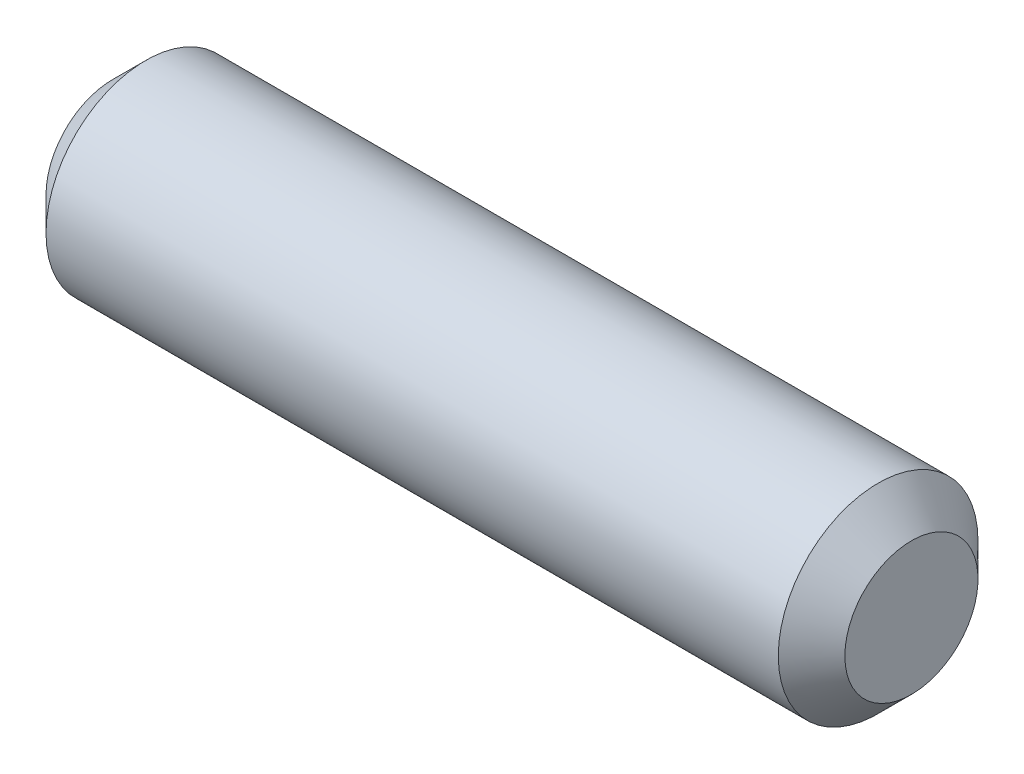
ISO-10303-21;
HEADER;
FILE_DESCRIPTION(('STEP AP214'),'2;1');
FILE_NAME('part.step','',(''),(''),'','','');
FILE_SCHEMA(('AUTOMOTIVE_DESIGN { 1 0 10303 214 1 1 1 1 }'));
ENDSEC;
DATA;
#1=APPLICATION_CONTEXT('core data for automotive mechanical design processes');
#2=APPLICATION_PROTOCOL_DEFINITION('international standard','automotive_design',2000,#1);
#3=PRODUCT_CONTEXT('',#1,'mechanical');
#4=PRODUCT('Part','Part','',(#3));
#5=PRODUCT_RELATED_PRODUCT_CATEGORY('part','',(#4));
#6=PRODUCT_DEFINITION_FORMATION('','',#4);
#7=PRODUCT_DEFINITION_CONTEXT('part definition',#1,'design');
#8=PRODUCT_DEFINITION('design','',#6,#7);
#9=PRODUCT_DEFINITION_SHAPE('','',#8);
#10=(LENGTH_UNIT() NAMED_UNIT(*) SI_UNIT(.MILLI.,.METRE.));
#11=(NAMED_UNIT(*) PLANE_ANGLE_UNIT() SI_UNIT($,.RADIAN.));
#12=(NAMED_UNIT(*) SI_UNIT($,.STERADIAN.) SOLID_ANGLE_UNIT());
#13=UNCERTAINTY_MEASURE_WITH_UNIT(LENGTH_MEASURE(1.E-05),#10,'distance_accuracy_value','');
#14=(GEOMETRIC_REPRESENTATION_CONTEXT(3) GLOBAL_UNCERTAINTY_ASSIGNED_CONTEXT((#13)) GLOBAL_UNIT_ASSIGNED_CONTEXT((#10,
#11,#12)) REPRESENTATION_CONTEXT('',''));
#15=CARTESIAN_POINT('',(0.,0.,0.));
#16=DIRECTION('',(0.,0.,1.));
#17=DIRECTION('',(1.,0.,0.));
#18=AXIS2_PLACEMENT_3D('',#15,#16,#17);
#19=CARTESIAN_POINT('',(6.,0.,0.));
#20=DIRECTION('',(-1.,0.,0.));
#21=DIRECTION('',(0.,0.,1.));
#22=AXIS2_PLACEMENT_3D('',#19,#20,#21);
#23=PLANE('',#22);
#24=CARTESIAN_POINT('',(6.,0.,0.));
#25=DIRECTION('',(-1.,0.,0.));
#26=DIRECTION('',(0.,0.,1.));
#27=AXIS2_PLACEMENT_3D('',#24,#25,#26);
#28=CIRCLE('',#27,0.999999999999997);
#29=CARTESIAN_POINT('',(6.,0.,0.999999999999997));
#30=VERTEX_POINT('',#29);
#31=EDGE_CURVE('E10',#30,#30,#28,.F.);
#32=ORIENTED_EDGE('',*,*,#31,.T.);
#33=EDGE_LOOP('',(#32));
#34=FACE_BOUND('',#33,.T.);
#35=ADVANCED_FACE('F40',(#34),#23,.F.);
#36=CARTESIAN_POINT('',(-6.,0.,0.));
#37=DIRECTION('',(-1.,0.,0.));
#38=DIRECTION('',(0.,0.,1.));
#39=AXIS2_PLACEMENT_3D('',#36,#37,#38);
#40=CYLINDRICAL_SURFACE('',#39,1.5);
#41=CARTESIAN_POINT('',(-5.5,0.,0.));
#42=DIRECTION('',(-1.,0.,0.));
#43=DIRECTION('',(0.,0.,1.));
#44=AXIS2_PLACEMENT_3D('',#41,#42,#43);
#45=CIRCLE('',#44,1.5);
#46=CARTESIAN_POINT('',(-5.5,0.,1.5));
#47=VERTEX_POINT('',#46);
#48=EDGE_CURVE('E48',#47,#47,#45,.F.);
#49=ORIENTED_EDGE('',*,*,#48,.T.);
#50=EDGE_LOOP('',(#49));
#51=FACE_BOUND('',#50,.T.);
#52=CARTESIAN_POINT('',(5.5,0.,0.));
#53=DIRECTION('',(-1.,0.,0.));
#54=DIRECTION('',(0.,0.,1.));
#55=AXIS2_PLACEMENT_3D('',#52,#53,#54);
#56=CIRCLE('',#55,1.5);
#57=CARTESIAN_POINT('',(5.5,0.,1.5));
#58=VERTEX_POINT('',#57);
#59=EDGE_CURVE('E52',#58,#58,#56,.T.);
#60=ORIENTED_EDGE('',*,*,#59,.T.);
#61=EDGE_LOOP('',(#60));
#62=FACE_BOUND('',#61,.T.);
#63=ADVANCED_FACE('F72',(#51,#62),#40,.T.);
#64=CARTESIAN_POINT('',(-6.,0.,0.));
#65=DIRECTION('',(-1.,0.,0.));
#66=DIRECTION('',(0.,0.,1.));
#67=AXIS2_PLACEMENT_3D('',#64,#65,#66);
#68=PLANE('',#67);
#69=CARTESIAN_POINT('',(-6.,0.,0.));
#70=DIRECTION('',(-1.,0.,0.));
#71=DIRECTION('',(0.,0.,1.));
#72=AXIS2_PLACEMENT_3D('',#69,#70,#71);
#73=CIRCLE('',#72,1.);
#74=CARTESIAN_POINT('',(-6.,0.,1.));
#75=VERTEX_POINT('',#74);
#76=EDGE_CURVE('E56',#75,#75,#73,.T.);
#77=ORIENTED_EDGE('',*,*,#76,.T.);
#78=EDGE_LOOP('',(#77));
#79=FACE_BOUND('',#78,.T.);
#80=ADVANCED_FACE('F62',(#79),#68,.T.);
#81=CARTESIAN_POINT('',(-6.,0.,0.));
#82=DIRECTION('',(1.,0.,0.));
#83=DIRECTION('',(0.,0.,-1.));
#84=AXIS2_PLACEMENT_3D('',#81,#82,#83);
#85=CONICAL_SURFACE('',#84,1.,0.785398163397446);
#86=ORIENTED_EDGE('',*,*,#48,.F.);
#87=EDGE_LOOP('',(#86));
#88=FACE_BOUND('',#87,.T.);
#89=ORIENTED_EDGE('',*,*,#76,.F.);
#90=EDGE_LOOP('',(#89));
#91=FACE_BOUND('',#90,.T.);
#92=ADVANCED_FACE('F64',(#88,#91),#85,.T.);
#93=CARTESIAN_POINT('',(5.5,0.,0.));
#94=DIRECTION('',(-1.,0.,0.));
#95=DIRECTION('',(0.,0.,1.));
#96=AXIS2_PLACEMENT_3D('',#93,#94,#95);
#97=CONICAL_SURFACE('',#96,1.5,0.78539816339745);
#98=ORIENTED_EDGE('',*,*,#31,.F.);
#99=EDGE_LOOP('',(#98));
#100=FACE_BOUND('',#99,.T.);
#101=ORIENTED_EDGE('',*,*,#59,.F.);
#102=EDGE_LOOP('',(#101));
#103=FACE_BOUND('',#102,.T.);
#104=ADVANCED_FACE('F43',(#100,#103),#97,.T.);
#105=CLOSED_SHELL('',(#35,#63,#80,#92,#104));
#106=MANIFOLD_SOLID_BREP('B2',#105);
#107=ADVANCED_BREP_SHAPE_REPRESENTATION('',(#18,#106),#14);
#108=SHAPE_DEFINITION_REPRESENTATION(#9,#107);
ENDSEC;
END-ISO-10303-21;
